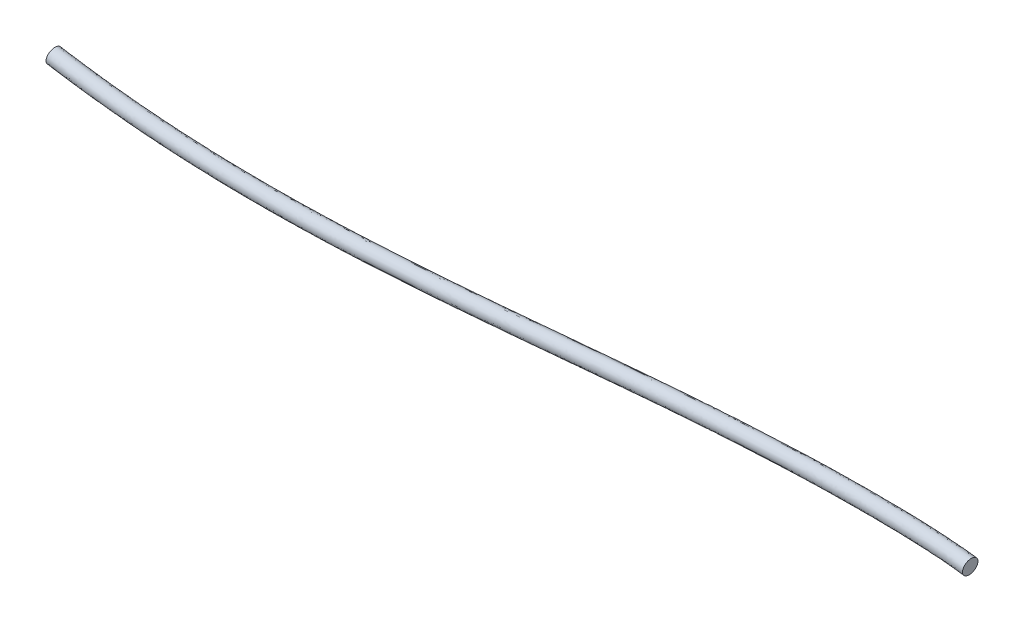
ISO-10303-21;
HEADER;
FILE_DESCRIPTION(('STEP AP214'),'2;1');
FILE_NAME('part.step','',(''),(''),'','','');
FILE_SCHEMA(('AUTOMOTIVE_DESIGN { 1 0 10303 214 1 1 1 1 }'));
ENDSEC;
DATA;
#1=APPLICATION_CONTEXT('core data for automotive mechanical design processes');
#2=APPLICATION_PROTOCOL_DEFINITION('international standard','automotive_design',2000,#1);
#3=PRODUCT_CONTEXT('',#1,'mechanical');
#4=PRODUCT('Part','Part','',(#3));
#5=PRODUCT_RELATED_PRODUCT_CATEGORY('part','',(#4));
#6=PRODUCT_DEFINITION_FORMATION('','',#4);
#7=PRODUCT_DEFINITION_CONTEXT('part definition',#1,'design');
#8=PRODUCT_DEFINITION('design','',#6,#7);
#9=PRODUCT_DEFINITION_SHAPE('','',#8);
#10=(LENGTH_UNIT() NAMED_UNIT(*) SI_UNIT(.MILLI.,.METRE.));
#11=(NAMED_UNIT(*) PLANE_ANGLE_UNIT() SI_UNIT($,.RADIAN.));
#12=(NAMED_UNIT(*) SI_UNIT($,.STERADIAN.) SOLID_ANGLE_UNIT());
#13=UNCERTAINTY_MEASURE_WITH_UNIT(LENGTH_MEASURE(1.E-05),#10,'distance_accuracy_value','');
#14=(GEOMETRIC_REPRESENTATION_CONTEXT(3) GLOBAL_UNCERTAINTY_ASSIGNED_CONTEXT((#13)) GLOBAL_UNIT_ASSIGNED_CONTEXT((#10,
#11,#12)) REPRESENTATION_CONTEXT('',''));
#15=CARTESIAN_POINT('',(0.,0.,0.));
#16=DIRECTION('',(0.,0.,1.));
#17=DIRECTION('',(1.,0.,0.));
#18=AXIS2_PLACEMENT_3D('',#15,#16,#17);
#19=CARTESIAN_POINT('',(-45.0248996878404,7.077953315822,0.));
#20=DIRECTION('',(0.986521990180811,-0.163628734914417,0.));
#21=DIRECTION('',(0.163628734914417,0.986521990180811,0.));
#22=AXIS2_PLACEMENT_3D('',#19,#20,#21);
#23=PLANE('',#22);
#24=CARTESIAN_POINT('',(-45.0248996878404,7.077953315822,0.));
#25=DIRECTION('',(0.986521990180811,-0.163628734914417,0.));
#26=DIRECTION('',(0.163628734914417,0.986521990180811,0.));
#27=AXIS2_PLACEMENT_3D('',#24,#25,#26);
#28=CIRCLE('',#27,0.5);
#29=CARTESIAN_POINT('',(-44.9430853203832,7.5712143109124,0.));
#30=VERTEX_POINT('',#29);
#31=EDGE_CURVE('E45',#30,#30,#28,.T.);
#32=ORIENTED_EDGE('',*,*,#31,.F.);
#33=EDGE_LOOP('',(#32));
#34=FACE_BOUND('',#33,.T.);
#35=ADVANCED_FACE('F38',(#34),#23,.F.);
#36=CARTESIAN_POINT('',(14.5423274305472,8.07810534186615,0.));
#37=DIRECTION('',(0.991012131899101,-0.133772024088744,0.));
#38=DIRECTION('',(0.133772024088744,0.991012131899101,0.));
#39=AXIS2_PLACEMENT_3D('',#36,#37,#38);
#40=PLANE('',#39);
#41=CARTESIAN_POINT('',(14.5423274305472,8.07810534186615,0.));
#42=DIRECTION('',(0.991012131899101,-0.133772024088744,0.));
#43=DIRECTION('',(0.133772024088744,0.991012131899101,0.));
#44=AXIS2_PLACEMENT_3D('',#41,#42,#43);
#45=CIRCLE('',#44,0.5);
#46=CARTESIAN_POINT('',(14.6092134425916,8.5736114078157,0.));
#47=VERTEX_POINT('',#46);
#48=EDGE_CURVE('E12',#47,#47,#45,.T.);
#49=ORIENTED_EDGE('',*,*,#48,.T.);
#50=EDGE_LOOP('',(#49));
#51=FACE_BOUND('',#50,.T.);
#52=ADVANCED_FACE('F52',(#51),#40,.T.);
#53=CARTESIAN_POINT('',(-44.9430853203832,7.5712143109124,0.));
#54=CARTESIAN_POINT('',(-26.7323535430056,4.55070485486177,0.));
#55=CARTESIAN_POINT('',(-8.51156065463564,9.2230163015384,0.));
#56=CARTESIAN_POINT('',(11.4756486405239,8.84984518759702,0.));
#57=CARTESIAN_POINT('',(13.0431831793779,8.78500239672337,0.));
#58=CARTESIAN_POINT('',(14.6092134425915,8.5736114078157,0.));
#59=CARTESIAN_POINT('',(-44.9430853203832,7.5712143109124,1.));
#60=CARTESIAN_POINT('',(-26.7323535430056,4.55070485486177,1.));
#61=CARTESIAN_POINT('',(-8.51156065463564,9.2230163015384,1.));
#62=CARTESIAN_POINT('',(11.4756486405239,8.84984518759702,1.));
#63=CARTESIAN_POINT('',(13.0431831793779,8.78500239672337,1.));
#64=CARTESIAN_POINT('',(14.6092134425915,8.5736114078157,1.));
#65=CARTESIAN_POINT('',(-45.1067140552976,6.58469232073159,1.));
#66=CARTESIAN_POINT('',(-26.6268629905371,3.51954559467261,1.));
#67=CARTESIAN_POINT('',(-8.34756860790307,8.2197802099376,1.));
#68=CARTESIAN_POINT('',(11.4415691671671,7.850307189763,1.));
#69=CARTESIAN_POINT('',(12.9703797328329,7.78576040630225,1.));
#70=CARTESIAN_POINT('',(14.4754414185028,7.5825992759166,1.));
#71=CARTESIAN_POINT('',(-45.1067140552976,6.58469232073159,0.));
#72=CARTESIAN_POINT('',(-26.6268629905371,3.5195455946726,0.));
#73=CARTESIAN_POINT('',(-8.34756860790307,8.21978020993759,0.));
#74=CARTESIAN_POINT('',(11.4415691671671,7.850307189763,0.));
#75=CARTESIAN_POINT('',(12.9703797328329,7.78576040630225,0.));
#76=CARTESIAN_POINT('',(14.4754414185028,7.5825992759166,0.));
#77=CARTESIAN_POINT('',(-45.1067140552976,6.58469232073159,-1.));
#78=CARTESIAN_POINT('',(-26.6268629905371,3.51954559467261,-1.));
#79=CARTESIAN_POINT('',(-8.34756860790307,8.2197802099376,-1.));
#80=CARTESIAN_POINT('',(11.4415691671671,7.850307189763,-1.));
#81=CARTESIAN_POINT('',(12.9703797328329,7.78576040630225,-1.));
#82=CARTESIAN_POINT('',(14.4754414185028,7.5825992759166,-1.));
#83=CARTESIAN_POINT('',(-44.9430853203832,7.5712143109124,-1.));
#84=CARTESIAN_POINT('',(-26.7323535430056,4.55070485486177,-1.));
#85=CARTESIAN_POINT('',(-8.51156065463564,9.2230163015384,-1.));
#86=CARTESIAN_POINT('',(11.4756486405239,8.84984518759702,-1.));
#87=CARTESIAN_POINT('',(13.0431831793779,8.78500239672337,-1.));
#88=CARTESIAN_POINT('',(14.6092134425915,8.5736114078157,-1.));
#89=CARTESIAN_POINT('',(-44.9430853203832,7.5712143109124,0.));
#90=CARTESIAN_POINT('',(-26.7323535430056,4.55070485486177,0.));
#91=CARTESIAN_POINT('',(-8.51156065463564,9.2230163015384,0.));
#92=CARTESIAN_POINT('',(11.4756486405239,8.84984518759702,0.));
#93=CARTESIAN_POINT('',(13.0431831793779,8.78500239672337,0.));
#94=CARTESIAN_POINT('',(14.6092134425915,8.5736114078157,0.));
#95=(BOUNDED_SURFACE() B_SPLINE_SURFACE(3,3,((#53,#54,#55,#56,#57,#58),(#59,#60,#61,#62,#63,
#64),(#65,#66,#67,#68,#69,#70),(#71,#72,#73,#74,#75,#76),(#77,#78,#79,#80,#81,#82),(#83,#84,#85,
#86,#87,#88),(#89,#90,#91,#92,#93,#94)),.UNSPECIFIED.,.T.,.F.,
.F.) B_SPLINE_SURFACE_WITH_KNOTS((4,3,4),(4,2,4),(0.,0.5,1.),(0.,0.922188555474766,1.),
.UNSPECIFIED.) GEOMETRIC_REPRESENTATION_ITEM() RATIONAL_B_SPLINE_SURFACE(((1.,1.,1.,1.,1.,1.),
(0.333333333333333,0.333333333333333,0.333333333333333,0.333333333333333,0.333333333333333,
0.333333333333333),(0.333333333333333,0.333333333333333,0.333333333333333,0.333333333333333,
0.333333333333333,0.333333333333333),(1.,1.,1.,1.,1.,1.),(0.333333333333333,0.333333333333333,
0.333333333333333,0.333333333333333,0.333333333333333,0.333333333333333),(0.333333333333333,
0.333333333333333,0.333333333333333,0.333333333333333,0.333333333333333,0.333333333333333),(1.,
1.,1.,1.,1.,1.))) REPRESENTATION_ITEM('') SURFACE());
#96=ORIENTED_EDGE('',*,*,#48,.F.);
#97=EDGE_LOOP('',(#96));
#98=FACE_BOUND('',#97,.T.);
#99=ORIENTED_EDGE('',*,*,#31,.T.);
#100=EDGE_LOOP('',(#99));
#101=FACE_BOUND('',#100,.T.);
#102=ADVANCED_FACE('F54',(#98,#101),#95,.T.);
#103=CLOSED_SHELL('',(#35,#52,#102));
#104=MANIFOLD_SOLID_BREP('B2',#103);
#105=ADVANCED_BREP_SHAPE_REPRESENTATION('',(#18,#104),#14);
#106=SHAPE_DEFINITION_REPRESENTATION(#9,#105);
ENDSEC;
END-ISO-10303-21;
